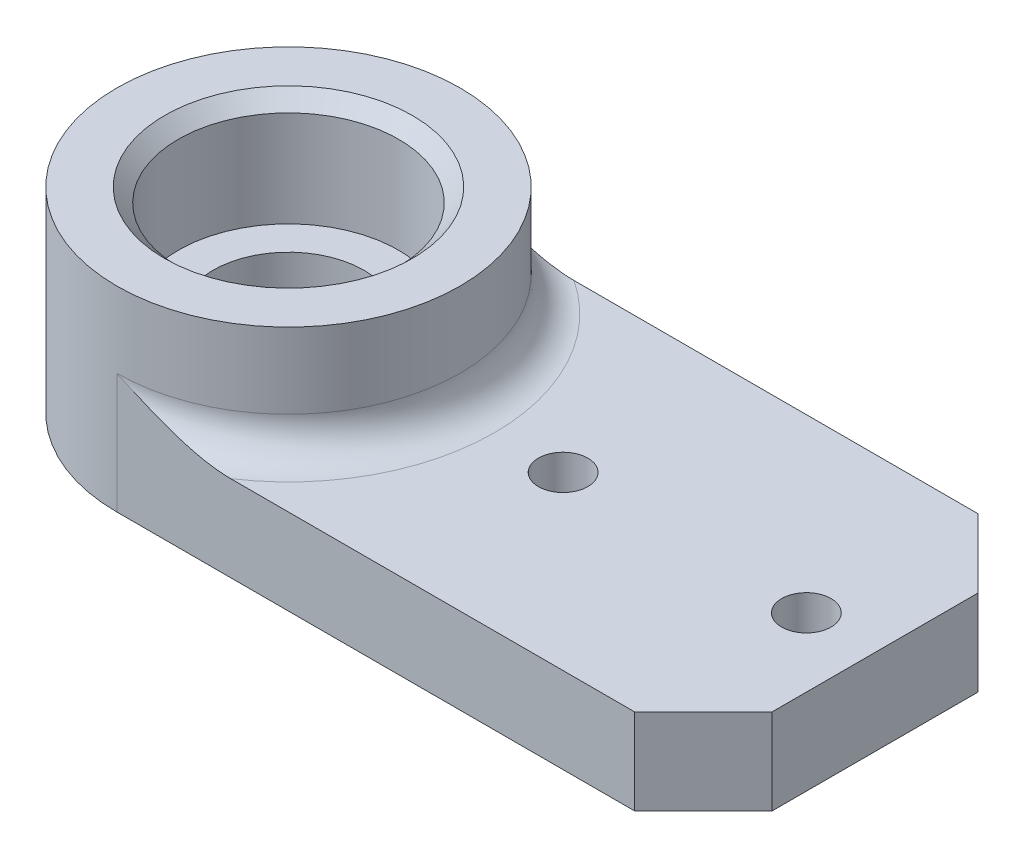
ISO-10303-21;
HEADER;
FILE_DESCRIPTION(('STEP AP214'),'2;1');
FILE_NAME('part.step','',(''),(''),'','','');
FILE_SCHEMA(('AUTOMOTIVE_DESIGN { 1 0 10303 214 1 1 1 1 }'));
ENDSEC;
DATA;
#1=APPLICATION_CONTEXT('core data for automotive mechanical design processes');
#2=APPLICATION_PROTOCOL_DEFINITION('international standard','automotive_design',2000,#1);
#3=PRODUCT_CONTEXT('',#1,'mechanical');
#4=PRODUCT('Part','Part','',(#3));
#5=PRODUCT_RELATED_PRODUCT_CATEGORY('part','',(#4));
#6=PRODUCT_DEFINITION_FORMATION('','',#4);
#7=PRODUCT_DEFINITION_CONTEXT('part definition',#1,'design');
#8=PRODUCT_DEFINITION('design','',#6,#7);
#9=PRODUCT_DEFINITION_SHAPE('','',#8);
#10=(LENGTH_UNIT() NAMED_UNIT(*) SI_UNIT(.MILLI.,.METRE.));
#11=(NAMED_UNIT(*) PLANE_ANGLE_UNIT() SI_UNIT($,.RADIAN.));
#12=(NAMED_UNIT(*) SI_UNIT($,.STERADIAN.) SOLID_ANGLE_UNIT());
#13=UNCERTAINTY_MEASURE_WITH_UNIT(LENGTH_MEASURE(1.E-05),#10,'distance_accuracy_value','');
#14=(GEOMETRIC_REPRESENTATION_CONTEXT(3) GLOBAL_UNCERTAINTY_ASSIGNED_CONTEXT((#13)) GLOBAL_UNIT_ASSIGNED_CONTEXT((#10,
#11,#12)) REPRESENTATION_CONTEXT('',''));
#15=CARTESIAN_POINT('',(0.,0.,0.));
#16=DIRECTION('',(0.,0.,1.));
#17=DIRECTION('',(1.,0.,0.));
#18=AXIS2_PLACEMENT_3D('',#15,#16,#17);
#19=CARTESIAN_POINT('',(0.,4.064,0.));
#20=DIRECTION('',(0.,-1.,0.));
#21=DIRECTION('',(0.,0.,-1.));
#22=AXIS2_PLACEMENT_3D('',#19,#20,#21);
#23=CYLINDRICAL_SURFACE('',#22,6.35);
#24=CARTESIAN_POINT('',(0.,4.064,0.));
#25=DIRECTION('',(0.,1.,0.));
#26=DIRECTION('',(0.,0.,1.));
#27=AXIS2_PLACEMENT_3D('',#24,#25,#26);
#28=CIRCLE('',#27,6.35);
#29=CARTESIAN_POINT('',(0.,4.064,6.35));
#30=VERTEX_POINT('',#29);
#31=EDGE_CURVE('E145',#30,#30,#28,.T.);
#32=ORIENTED_EDGE('',*,*,#31,.F.);
#33=EDGE_LOOP('',(#32));
#34=FACE_BOUND('',#33,.T.);
#35=DIRECTION('',(0.,-1.,0.));
#36=VECTOR('',#35,1.);
#37=CARTESIAN_POINT('',(0.,0.,6.35));
#38=LINE('',#37,#36);
#39=CARTESIAN_POINT('',(0.,1.27,6.35));
#40=VERTEX_POINT('',#39);
#41=CARTESIAN_POINT('',(0.,-3.175,6.35));
#42=VERTEX_POINT('',#41);
#43=EDGE_CURVE('E130',#40,#42,#38,.T.);
#44=ORIENTED_EDGE('',*,*,#43,.F.);
#45=CARTESIAN_POINT('',(0.,1.27,0.));
#46=DIRECTION('',(0.,1.,0.));
#47=DIRECTION('',(0.,0.,1.));
#48=AXIS2_PLACEMENT_3D('',#45,#46,#47);
#49=CIRCLE('',#48,6.35);
#50=CARTESIAN_POINT('',(0.,1.27,-6.35));
#51=VERTEX_POINT('',#50);
#52=EDGE_CURVE('E127',#40,#51,#49,.T.);
#53=ORIENTED_EDGE('',*,*,#52,.T.);
#54=DIRECTION('',(0.,-1.,0.));
#55=VECTOR('',#54,1.);
#56=CARTESIAN_POINT('',(0.,0.,-6.35));
#57=LINE('',#56,#55);
#58=CARTESIAN_POINT('',(0.,-3.175,-6.35));
#59=VERTEX_POINT('',#58);
#60=EDGE_CURVE('E114',#51,#59,#57,.T.);
#61=ORIENTED_EDGE('',*,*,#60,.T.);
#62=CARTESIAN_POINT('',(0.,-3.175,0.));
#63=DIRECTION('',(0.,-1.,0.));
#64=DIRECTION('',(0.,0.,-1.));
#65=AXIS2_PLACEMENT_3D('',#62,#63,#64);
#66=CIRCLE('',#65,6.35);
#67=EDGE_CURVE('E125',#42,#59,#66,.T.);
#68=ORIENTED_EDGE('',*,*,#67,.F.);
#69=EDGE_LOOP('',(#44,#53,#61,#68));
#70=FACE_BOUND('',#69,.T.);
#71=ADVANCED_FACE('F47',(#34,#70),#23,.T.);
#72=CARTESIAN_POINT('',(0.,4.064,0.));
#73=DIRECTION('',(0.,1.,0.));
#74=DIRECTION('',(0.,0.,1.));
#75=AXIS2_PLACEMENT_3D('',#72,#73,#74);
#76=PLANE('',#75);
#77=CARTESIAN_POINT('',(0.,4.064,0.));
#78=DIRECTION('',(0.,1.,0.));
#79=DIRECTION('',(0.,0.,1.));
#80=AXIS2_PLACEMENT_3D('',#77,#78,#79);
#81=CIRCLE('',#80,4.5847);
#82=CARTESIAN_POINT('',(0.,4.064,4.5847));
#83=VERTEX_POINT('',#82);
#84=EDGE_CURVE('E309',#83,#83,#81,.F.);
#85=ORIENTED_EDGE('',*,*,#84,.T.);
#86=EDGE_LOOP('',(#85));
#87=FACE_BOUND('',#86,.T.);
#88=ORIENTED_EDGE('',*,*,#31,.T.);
#89=EDGE_LOOP('',(#88));
#90=FACE_BOUND('',#89,.T.);
#91=ADVANCED_FACE('F210',(#87,#90),#76,.T.);
#92=CARTESIAN_POINT('',(0.,4.064,0.));
#93=DIRECTION('',(0.,-1.,0.));
#94=DIRECTION('',(0.,0.,-1.));
#95=AXIS2_PLACEMENT_3D('',#92,#93,#94);
#96=CYLINDRICAL_SURFACE('',#95,4.0767);
#97=CARTESIAN_POINT('',(0.,3.556,0.));
#98=DIRECTION('',(0.,1.,0.));
#99=DIRECTION('',(0.,0.,1.));
#100=AXIS2_PLACEMENT_3D('',#97,#98,#99);
#101=CIRCLE('',#100,4.0767);
#102=CARTESIAN_POINT('',(0.,3.556,4.0767));
#103=VERTEX_POINT('',#102);
#104=EDGE_CURVE('E321',#103,#103,#101,.T.);
#105=ORIENTED_EDGE('',*,*,#104,.T.);
#106=EDGE_LOOP('',(#105));
#107=FACE_BOUND('',#106,.T.);
#108=CARTESIAN_POINT('',(0.,0.,0.));
#109=DIRECTION('',(0.,1.,0.));
#110=DIRECTION('',(0.,0.,1.));
#111=AXIS2_PLACEMENT_3D('',#108,#109,#110);
#112=CIRCLE('',#111,4.0767);
#113=CARTESIAN_POINT('',(0.,0.,4.0767));
#114=VERTEX_POINT('',#113);
#115=EDGE_CURVE('E139',#114,#114,#112,.T.);
#116=ORIENTED_EDGE('',*,*,#115,.F.);
#117=EDGE_LOOP('',(#116));
#118=FACE_BOUND('',#117,.T.);
#119=ADVANCED_FACE('F216',(#107,#118),#96,.F.);
#120=CARTESIAN_POINT('',(0.,0.,0.));
#121=DIRECTION('',(0.,-1.,0.));
#122=DIRECTION('',(0.,0.,-1.));
#123=AXIS2_PLACEMENT_3D('',#120,#121,#122);
#124=PLANE('',#123);
#125=CARTESIAN_POINT('',(0.,0.,0.));
#126=DIRECTION('',(0.,-1.,0.));
#127=DIRECTION('',(0.,0.,-1.));
#128=AXIS2_PLACEMENT_3D('',#125,#126,#127);
#129=CIRCLE('',#128,2.794);
#130=CARTESIAN_POINT('',(0.,0.,-2.794));
#131=VERTEX_POINT('',#130);
#132=EDGE_CURVE('E148',#131,#131,#129,.T.);
#133=ORIENTED_EDGE('',*,*,#132,.T.);
#134=EDGE_LOOP('',(#133));
#135=FACE_BOUND('',#134,.T.);
#136=ORIENTED_EDGE('',*,*,#115,.T.);
#137=EDGE_LOOP('',(#136));
#138=FACE_BOUND('',#137,.T.);
#139=ADVANCED_FACE('F223',(#135,#138),#124,.F.);
#140=CARTESIAN_POINT('',(0.,-3.175,0.));
#141=DIRECTION('',(0.,-1.,0.));
#142=DIRECTION('',(0.,0.,-1.));
#143=AXIS2_PLACEMENT_3D('',#140,#141,#142);
#144=PLANE('',#143);
#145=DIRECTION('',(0.,0.,-1.));
#146=VECTOR('',#145,1.);
#147=CARTESIAN_POINT('',(21.69922,-3.175,-6.35));
#148=LINE('',#147,#146);
#149=CARTESIAN_POINT('',(21.69922,-3.175,3.80999999999999));
#150=VERTEX_POINT('',#149);
#151=CARTESIAN_POINT('',(21.69922,-3.175,-3.80999999999999));
#152=VERTEX_POINT('',#151);
#153=EDGE_CURVE('E121',#150,#152,#148,.T.);
#154=ORIENTED_EDGE('',*,*,#153,.F.);
#155=DIRECTION('',(0.707106781186549,0.,-0.707106781186546));
#156=VECTOR('',#155,1.);
#157=CARTESIAN_POINT('',(12.75461,-3.175,12.75461));
#158=LINE('',#157,#156);
#159=CARTESIAN_POINT('',(19.15922,-3.175,6.35));
#160=VERTEX_POINT('',#159);
#161=EDGE_CURVE('E302',#150,#160,#158,.F.);
#162=ORIENTED_EDGE('',*,*,#161,.T.);
#163=DIRECTION('',(1.,0.,0.));
#164=VECTOR('',#163,1.);
#165=CARTESIAN_POINT('',(21.69922,-3.175,6.35));
#166=LINE('',#165,#164);
#167=EDGE_CURVE('E137',#42,#160,#166,.T.);
#168=ORIENTED_EDGE('',*,*,#167,.F.);
#169=ORIENTED_EDGE('',*,*,#67,.T.);
#170=DIRECTION('',(-1.,0.,0.));
#171=VECTOR('',#170,1.);
#172=CARTESIAN_POINT('',(0.,-3.175,-6.35));
#173=LINE('',#172,#171);
#174=CARTESIAN_POINT('',(19.15922,-3.175,-6.35));
#175=VERTEX_POINT('',#174);
#176=EDGE_CURVE('E110',#175,#59,#173,.T.);
#177=ORIENTED_EDGE('',*,*,#176,.F.);
#178=DIRECTION('',(-0.707106781186546,0.,-0.707106781186549));
#179=VECTOR('',#178,1.);
#180=CARTESIAN_POINT('',(12.7546100000001,-3.175,-12.75461));
#181=LINE('',#180,#179);
#182=EDGE_CURVE('E304',#175,#152,#181,.F.);
#183=ORIENTED_EDGE('',*,*,#182,.T.);
#184=EDGE_LOOP('',(#154,#162,#168,#169,#177,#183));
#185=FACE_BOUND('',#184,.T.);
#186=CARTESIAN_POINT('',(0.,-3.175,0.));
#187=DIRECTION('',(0.,-1.,0.));
#188=DIRECTION('',(0.,0.,-1.));
#189=AXIS2_PLACEMENT_3D('',#186,#187,#188);
#190=CIRCLE('',#189,2.794);
#191=CARTESIAN_POINT('',(0.,-3.175,-2.794));
#192=VERTEX_POINT('',#191);
#193=EDGE_CURVE('E140',#192,#192,#190,.T.);
#194=ORIENTED_EDGE('',*,*,#193,.F.);
#195=EDGE_LOOP('',(#194));
#196=FACE_BOUND('',#195,.T.);
#197=CARTESIAN_POINT('',(19.15922,-3.175,0.));
#198=DIRECTION('',(0.,1.,0.));
#199=DIRECTION('',(0.,0.,1.));
#200=AXIS2_PLACEMENT_3D('',#197,#198,#199);
#201=CIRCLE('',#200,0.914399999999999);
#202=CARTESIAN_POINT('',(19.15922,-3.175,0.914399999999999));
#203=VERTEX_POINT('',#202);
#204=EDGE_CURVE('E263',#203,#203,#201,.T.);
#205=ORIENTED_EDGE('',*,*,#204,.T.);
#206=EDGE_LOOP('',(#205));
#207=FACE_BOUND('',#206,.T.);
#208=CARTESIAN_POINT('',(10.16,-3.175,0.));
#209=DIRECTION('',(0.,1.,0.));
#210=DIRECTION('',(0.,0.,1.));
#211=AXIS2_PLACEMENT_3D('',#208,#209,#210);
#212=CIRCLE('',#211,0.914399999999999);
#213=CARTESIAN_POINT('',(10.16,-3.175,0.914399999999999));
#214=VERTEX_POINT('',#213);
#215=EDGE_CURVE('E271',#214,#214,#212,.T.);
#216=ORIENTED_EDGE('',*,*,#215,.T.);
#217=EDGE_LOOP('',(#216));
#218=FACE_BOUND('',#217,.T.);
#219=ADVANCED_FACE('F135',(#185,#196,#207,#218),#144,.T.);
#220=CARTESIAN_POINT('',(0.,-3.175,0.));
#221=DIRECTION('',(0.,1.,0.));
#222=DIRECTION('',(0.,0.,1.));
#223=AXIS2_PLACEMENT_3D('',#220,#221,#222);
#224=CYLINDRICAL_SURFACE('',#223,2.794);
#225=ORIENTED_EDGE('',*,*,#193,.T.);
#226=EDGE_LOOP('',(#225));
#227=FACE_BOUND('',#226,.T.);
#228=ORIENTED_EDGE('',*,*,#132,.F.);
#229=EDGE_LOOP('',(#228));
#230=FACE_BOUND('',#229,.T.);
#231=ADVANCED_FACE('F232',(#227,#230),#224,.F.);
#232=CARTESIAN_POINT('',(0.,0.,0.));
#233=DIRECTION('',(0.,1.,0.));
#234=DIRECTION('',(0.,0.,1.));
#235=AXIS2_PLACEMENT_3D('',#232,#233,#234);
#236=PLANE('',#235);
#237=CARTESIAN_POINT('',(19.15922,0.,0.));
#238=DIRECTION('',(0.,1.,0.));
#239=DIRECTION('',(0.,0.,1.));
#240=AXIS2_PLACEMENT_3D('',#237,#238,#239);
#241=CIRCLE('',#240,0.914399999999999);
#242=CARTESIAN_POINT('',(19.15922,0.,0.914399999999999));
#243=VERTEX_POINT('',#242);
#244=EDGE_CURVE('E255',#243,#243,#241,.T.);
#245=ORIENTED_EDGE('',*,*,#244,.F.);
#246=EDGE_LOOP('',(#245));
#247=FACE_BOUND('',#246,.T.);
#248=DIRECTION('',(1.,0.,0.));
#249=VECTOR('',#248,1.);
#250=CARTESIAN_POINT('',(21.69922,0.,6.35));
#251=LINE('',#250,#249);
#252=CARTESIAN_POINT('',(4.21211348375136,0.,6.35));
#253=VERTEX_POINT('',#252);
#254=CARTESIAN_POINT('',(19.15922,0.,6.35));
#255=VERTEX_POINT('',#254);
#256=EDGE_CURVE('E120',#253,#255,#251,.T.);
#257=ORIENTED_EDGE('',*,*,#256,.T.);
#258=DIRECTION('',(-0.707106781186549,0.,0.707106781186546));
#259=VECTOR('',#258,1.);
#260=CARTESIAN_POINT('',(12.75461,0.,12.75461));
#261=LINE('',#260,#259);
#262=CARTESIAN_POINT('',(21.69922,0.,3.80999999999999));
#263=VERTEX_POINT('',#262);
#264=EDGE_CURVE('E57',#255,#263,#261,.F.);
#265=ORIENTED_EDGE('',*,*,#264,.T.);
#266=DIRECTION('',(0.,0.,-1.));
#267=VECTOR('',#266,1.);
#268=CARTESIAN_POINT('',(21.69922,0.,-6.35));
#269=LINE('',#268,#267);
#270=CARTESIAN_POINT('',(21.69922,0.,-3.80999999999999));
#271=VERTEX_POINT('',#270);
#272=EDGE_CURVE('E258',#263,#271,#269,.T.);
#273=ORIENTED_EDGE('',*,*,#272,.T.);
#274=DIRECTION('',(0.707106781186546,0.,0.707106781186549));
#275=VECTOR('',#274,1.);
#276=CARTESIAN_POINT('',(12.7546100000001,0.,-12.75461));
#277=LINE('',#276,#275);
#278=CARTESIAN_POINT('',(19.15922,0.,-6.35));
#279=VERTEX_POINT('',#278);
#280=EDGE_CURVE('E64',#271,#279,#277,.F.);
#281=ORIENTED_EDGE('',*,*,#280,.T.);
#282=DIRECTION('',(-1.,0.,0.));
#283=VECTOR('',#282,1.);
#284=CARTESIAN_POINT('',(0.,0.,-6.35));
#285=LINE('',#284,#283);
#286=CARTESIAN_POINT('',(4.21211348375136,0.,-6.35));
#287=VERTEX_POINT('',#286);
#288=EDGE_CURVE('E131',#279,#287,#285,.T.);
#289=ORIENTED_EDGE('',*,*,#288,.T.);
#290=CARTESIAN_POINT('',(0.,0.,0.));
#291=DIRECTION('',(0.,1.,0.));
#292=DIRECTION('',(0.,0.,1.));
#293=AXIS2_PLACEMENT_3D('',#290,#291,#292);
#294=CIRCLE('',#293,7.62);
#295=EDGE_CURVE('E155',#287,#253,#294,.F.);
#296=ORIENTED_EDGE('',*,*,#295,.T.);
#297=EDGE_LOOP('',(#257,#265,#273,#281,#289,#296));
#298=FACE_BOUND('',#297,.T.);
#299=CARTESIAN_POINT('',(10.16,0.,0.));
#300=DIRECTION('',(0.,1.,0.));
#301=DIRECTION('',(0.,0.,1.));
#302=AXIS2_PLACEMENT_3D('',#299,#300,#301);
#303=CIRCLE('',#302,0.914399999999999);
#304=CARTESIAN_POINT('',(10.16,0.,0.914399999999999));
#305=VERTEX_POINT('',#304);
#306=EDGE_CURVE('E267',#305,#305,#303,.T.);
#307=ORIENTED_EDGE('',*,*,#306,.F.);
#308=EDGE_LOOP('',(#307));
#309=FACE_BOUND('',#308,.T.);
#310=ADVANCED_FACE('F234',(#247,#298,#309),#236,.T.);
#311=CARTESIAN_POINT('',(21.69922,0.,6.35));
#312=DIRECTION('',(0.,0.,-1.));
#313=DIRECTION('',(-1.,0.,0.));
#314=AXIS2_PLACEMENT_3D('',#311,#312,#313);
#315=PLANE('',#314);
#316=ORIENTED_EDGE('',*,*,#167,.T.);
#317=DIRECTION('',(0.,1.,0.));
#318=VECTOR('',#317,1.);
#319=CARTESIAN_POINT('',(19.15922,0.,6.35));
#320=LINE('',#319,#318);
#321=EDGE_CURVE('E72',#160,#255,#320,.T.);
#322=ORIENTED_EDGE('',*,*,#321,.T.);
#323=ORIENTED_EDGE('',*,*,#256,.F.);
#324=CARTESIAN_POINT('',(4.21211348375136,0.,6.35));
#325=CARTESIAN_POINT('',(4.13377982539869,9.32809724338397E-06,6.35));
#326=CARTESIAN_POINT('',(4.05547762005997,0.00221314538582465,6.35));
#327=CARTESIAN_POINT('',(3.89912627238215,0.0105673441240497,6.35));
#328=CARTESIAN_POINT('',(3.82107700890877,0.0167154187840262,6.35));
#329=CARTESIAN_POINT('',(3.58791834844959,0.0403705433787401,6.35));
#330=CARTESIAN_POINT('',(3.43333179696175,0.063093838840341,6.35));
#331=CARTESIAN_POINT('',(3.12797468190398,0.11933108703595,6.35));
#332=CARTESIAN_POINT('',(2.97718086231471,0.152723992343697,6.35));
#333=CARTESIAN_POINT('',(2.67768622409977,0.228215895425906,6.35));
#334=CARTESIAN_POINT('',(2.5289872611426,0.270322150112286,6.35));
#335=CARTESIAN_POINT('',(2.17849020552133,0.378429093264519,6.35));
#336=CARTESIAN_POINT('',(1.97764126772018,0.447475492504243,6.35));
#337=CARTESIAN_POINT('',(1.57935434821304,0.594581884928919,6.35));
#338=CARTESIAN_POINT('',(1.38191618942023,0.672641408527917,6.35));
#339=CARTESIAN_POINT('',(0.792041396026628,0.915867205070968,6.35));
#340=CARTESIAN_POINT('',(0.403230047215013,1.08967100392141,6.35));
#341=CARTESIAN_POINT('',(0.00969916817529066,1.26566241393811,6.35));
#342=CARTESIAN_POINT('',(0.00484957852140368,1.26783121664973,6.35));
#343=CARTESIAN_POINT('',(0.,1.27,6.35));
#344=B_SPLINE_CURVE_WITH_KNOTS('',3,(#324,#325,#326,#327,#328,#329,#330,#331,#332,#333,#334,
#335,#336,#337,#338,#339,#340,#341,#342,#343),.UNSPECIFIED.,.F.,.F.,(4,2,2,2,2,2,2,2,2,4),(0.,
0.234921345678261,0.469705423255124,0.937880312779526,1.40092183800859,1.86435057069797,
2.50117188652601,3.13796003876785,4.41529166354961,4.43122904101191),.UNSPECIFIED.);
#345=EDGE_CURVE('E161',#253,#40,#344,.T.);
#346=ORIENTED_EDGE('',*,*,#345,.T.);
#347=ORIENTED_EDGE('',*,*,#43,.T.);
#348=EDGE_LOOP('',(#316,#322,#323,#346,#347));
#349=FACE_BOUND('',#348,.T.);
#350=ADVANCED_FACE('F178',(#349),#315,.F.);
#351=CARTESIAN_POINT('',(21.69922,0.,-6.35));
#352=DIRECTION('',(-1.,0.,0.));
#353=DIRECTION('',(0.,0.,1.));
#354=AXIS2_PLACEMENT_3D('',#351,#352,#353);
#355=PLANE('',#354);
#356=ORIENTED_EDGE('',*,*,#272,.F.);
#357=DIRECTION('',(0.,-1.,0.));
#358=VECTOR('',#357,1.);
#359=CARTESIAN_POINT('',(21.69922,0.,3.81));
#360=LINE('',#359,#358);
#361=EDGE_CURVE('E299',#263,#150,#360,.T.);
#362=ORIENTED_EDGE('',*,*,#361,.T.);
#363=ORIENTED_EDGE('',*,*,#153,.T.);
#364=DIRECTION('',(0.,1.,0.));
#365=VECTOR('',#364,1.);
#366=CARTESIAN_POINT('',(21.69922,0.,-3.80999999999999));
#367=LINE('',#366,#365);
#368=EDGE_CURVE('E301',#152,#271,#367,.T.);
#369=ORIENTED_EDGE('',*,*,#368,.T.);
#370=EDGE_LOOP('',(#356,#362,#363,#369));
#371=FACE_BOUND('',#370,.T.);
#372=ADVANCED_FACE('F290',(#371),#355,.F.);
#373=CARTESIAN_POINT('',(0.,0.,-6.35));
#374=DIRECTION('',(0.,0.,1.));
#375=DIRECTION('',(1.,0.,0.));
#376=AXIS2_PLACEMENT_3D('',#373,#374,#375);
#377=PLANE('',#376);
#378=ORIENTED_EDGE('',*,*,#288,.F.);
#379=DIRECTION('',(0.,-1.,0.));
#380=VECTOR('',#379,1.);
#381=CARTESIAN_POINT('',(19.15922,0.,-6.35));
#382=LINE('',#381,#380);
#383=EDGE_CURVE('E11',#279,#175,#382,.T.);
#384=ORIENTED_EDGE('',*,*,#383,.T.);
#385=ORIENTED_EDGE('',*,*,#176,.T.);
#386=ORIENTED_EDGE('',*,*,#60,.F.);
#387=CARTESIAN_POINT('',(4.21211348375136,0.,-6.35));
#388=CARTESIAN_POINT('',(4.13377982539869,9.32809724354158E-06,-6.35));
#389=CARTESIAN_POINT('',(4.05547762005997,0.00221314538582483,-6.35));
#390=CARTESIAN_POINT('',(3.89912627238215,0.0105673441240498,-6.35));
#391=CARTESIAN_POINT('',(3.82107700890877,0.0167154187840262,-6.35));
#392=CARTESIAN_POINT('',(3.58791834844959,0.04037054337874,-6.35));
#393=CARTESIAN_POINT('',(3.43333179696175,0.0630938388403411,-6.35));
#394=CARTESIAN_POINT('',(3.12797468190397,0.11933108703595,-6.35));
#395=CARTESIAN_POINT('',(2.9771808623147,0.152723992343698,-6.35));
#396=CARTESIAN_POINT('',(2.67768622409976,0.228215895425907,-6.35));
#397=CARTESIAN_POINT('',(2.5289872611426,0.270322150112286,-6.35));
#398=CARTESIAN_POINT('',(2.17849020552132,0.37842909326452,-6.35));
#399=CARTESIAN_POINT('',(1.97764126772017,0.447475492504244,-6.35));
#400=CARTESIAN_POINT('',(1.57935434821303,0.594581884928921,-6.35));
#401=CARTESIAN_POINT('',(1.38191618942022,0.672641408527917,-6.35));
#402=CARTESIAN_POINT('',(0.792041396026627,0.915867205070968,-6.35));
#403=CARTESIAN_POINT('',(0.403230047215014,1.08967100392141,-6.35));
#404=CARTESIAN_POINT('',(0.00969916817529084,1.26566241393811,-6.35));
#405=CARTESIAN_POINT('',(0.00484957852140377,1.26783121664973,-6.35));
#406=CARTESIAN_POINT('',(0.,1.27,-6.35));
#407=B_SPLINE_CURVE_WITH_KNOTS('',3,(#387,#388,#389,#390,#391,#392,#393,#394,#395,#396,#397,
#398,#399,#400,#401,#402,#403,#404,#405,#406),.UNSPECIFIED.,.F.,.F.,(4,2,2,2,2,2,2,2,2,4),(0.,
0.234921345678262,0.469705423255125,0.937880312779528,1.40092183800859,1.86435057069797,
2.50117188652601,3.13796003876785,4.41529166354961,4.43122904101191),.UNSPECIFIED.);
#408=EDGE_CURVE('E171',#51,#287,#407,.F.);
#409=ORIENTED_EDGE('',*,*,#408,.T.);
#410=EDGE_LOOP('',(#378,#384,#385,#386,#409));
#411=FACE_BOUND('',#410,.T.);
#412=ADVANCED_FACE('F112',(#411),#377,.F.);
#413=CARTESIAN_POINT('',(19.15922,0.,0.));
#414=DIRECTION('',(0.,-1.,0.));
#415=DIRECTION('',(0.,0.,-1.));
#416=AXIS2_PLACEMENT_3D('',#413,#414,#415);
#417=CYLINDRICAL_SURFACE('',#416,0.914399999999999);
#418=ORIENTED_EDGE('',*,*,#244,.T.);
#419=EDGE_LOOP('',(#418));
#420=FACE_BOUND('',#419,.T.);
#421=ORIENTED_EDGE('',*,*,#204,.F.);
#422=EDGE_LOOP('',(#421));
#423=FACE_BOUND('',#422,.T.);
#424=ADVANCED_FACE('F281',(#420,#423),#417,.F.);
#425=CARTESIAN_POINT('',(10.16,0.,0.));
#426=DIRECTION('',(0.,-1.,0.));
#427=DIRECTION('',(0.,0.,-1.));
#428=AXIS2_PLACEMENT_3D('',#425,#426,#427);
#429=CYLINDRICAL_SURFACE('',#428,0.914399999999999);
#430=ORIENTED_EDGE('',*,*,#306,.T.);
#431=EDGE_LOOP('',(#430));
#432=FACE_BOUND('',#431,.T.);
#433=ORIENTED_EDGE('',*,*,#215,.F.);
#434=EDGE_LOOP('',(#433));
#435=FACE_BOUND('',#434,.T.);
#436=ADVANCED_FACE('F188',(#432,#435),#429,.F.);
#437=CARTESIAN_POINT('',(0.,1.27,0.));
#438=DIRECTION('',(0.,1.,0.));
#439=DIRECTION('',(0.,0.,1.));
#440=AXIS2_PLACEMENT_3D('',#437,#438,#439);
#441=TOROIDAL_SURFACE('',#440,7.62,1.27);
#442=ORIENTED_EDGE('',*,*,#408,.F.);
#443=ORIENTED_EDGE('',*,*,#52,.F.);
#444=ORIENTED_EDGE('',*,*,#345,.F.);
#445=ORIENTED_EDGE('',*,*,#295,.F.);
#446=EDGE_LOOP('',(#442,#443,#444,#445));
#447=FACE_BOUND('',#446,.T.);
#448=ADVANCED_FACE('F182',(#447),#441,.F.);
#449=CARTESIAN_POINT('',(0.,3.556,0.));
#450=DIRECTION('',(0.,1.,0.));
#451=DIRECTION('',(0.,0.,1.));
#452=AXIS2_PLACEMENT_3D('',#449,#450,#451);
#453=CONICAL_SURFACE('',#452,4.0767,0.785398163397448);
#454=ORIENTED_EDGE('',*,*,#84,.F.);
#455=EDGE_LOOP('',(#454));
#456=FACE_BOUND('',#455,.T.);
#457=ORIENTED_EDGE('',*,*,#104,.F.);
#458=EDGE_LOOP('',(#457));
#459=FACE_BOUND('',#458,.T.);
#460=ADVANCED_FACE('F187',(#456,#459),#453,.F.);
#461=CARTESIAN_POINT('',(21.69922,0.,3.81));
#462=DIRECTION('',(-0.707106781186546,0.,-0.707106781186549));
#463=DIRECTION('',(0.,-1.,0.));
#464=AXIS2_PLACEMENT_3D('',#461,#462,#463);
#465=PLANE('',#464);
#466=ORIENTED_EDGE('',*,*,#264,.F.);
#467=ORIENTED_EDGE('',*,*,#321,.F.);
#468=ORIENTED_EDGE('',*,*,#161,.F.);
#469=ORIENTED_EDGE('',*,*,#361,.F.);
#470=EDGE_LOOP('',(#466,#467,#468,#469));
#471=FACE_BOUND('',#470,.T.);
#472=ADVANCED_FACE('F197',(#471),#465,.F.);
#473=CARTESIAN_POINT('',(19.15922,0.,-6.35));
#474=DIRECTION('',(-0.707106781186549,0.,0.707106781186546));
#475=DIRECTION('',(0.,-1.,0.));
#476=AXIS2_PLACEMENT_3D('',#473,#474,#475);
#477=PLANE('',#476);
#478=ORIENTED_EDGE('',*,*,#280,.F.);
#479=ORIENTED_EDGE('',*,*,#368,.F.);
#480=ORIENTED_EDGE('',*,*,#182,.F.);
#481=ORIENTED_EDGE('',*,*,#383,.F.);
#482=EDGE_LOOP('',(#478,#479,#480,#481));
#483=FACE_BOUND('',#482,.T.);
#484=ADVANCED_FACE('F50',(#483),#477,.F.);
#485=CLOSED_SHELL('',(#71,#91,#119,#139,#219,#231,#310,#350,#372,#412,#424,#436,#448,#460,#472,#484));
#486=MANIFOLD_SOLID_BREP('B2',#485);
#487=ADVANCED_BREP_SHAPE_REPRESENTATION('',(#18,#486),#14);
#488=SHAPE_DEFINITION_REPRESENTATION(#9,#487);
ENDSEC;
END-ISO-10303-21;
